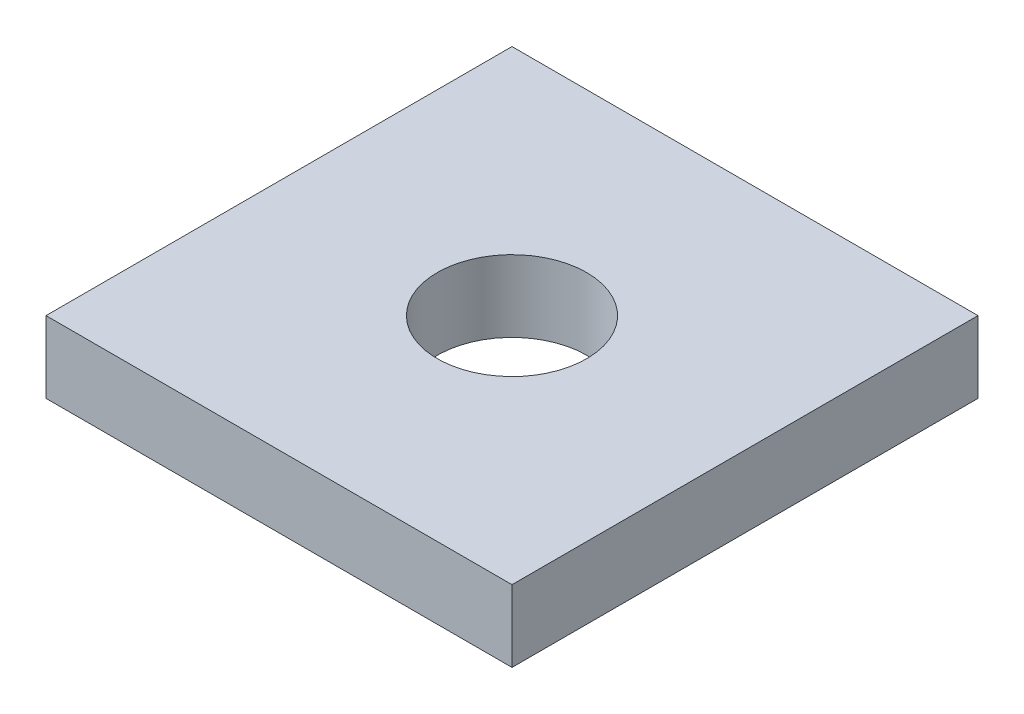
ISO-10303-21;
HEADER;
FILE_DESCRIPTION(('STEP AP214'),'2;1');
FILE_NAME('part.step','',(''),(''),'','','');
FILE_SCHEMA(('AUTOMOTIVE_DESIGN { 1 0 10303 214 1 1 1 1 }'));
ENDSEC;
DATA;
#1=APPLICATION_CONTEXT('core data for automotive mechanical design processes');
#2=APPLICATION_PROTOCOL_DEFINITION('international standard','automotive_design',2000,#1);
#3=PRODUCT_CONTEXT('',#1,'mechanical');
#4=PRODUCT('Part','Part','',(#3));
#5=PRODUCT_RELATED_PRODUCT_CATEGORY('part','',(#4));
#6=PRODUCT_DEFINITION_FORMATION('','',#4);
#7=PRODUCT_DEFINITION_CONTEXT('part definition',#1,'design');
#8=PRODUCT_DEFINITION('design','',#6,#7);
#9=PRODUCT_DEFINITION_SHAPE('','',#8);
#10=(LENGTH_UNIT() NAMED_UNIT(*) SI_UNIT(.MILLI.,.METRE.));
#11=(NAMED_UNIT(*) PLANE_ANGLE_UNIT() SI_UNIT($,.RADIAN.));
#12=(NAMED_UNIT(*) SI_UNIT($,.STERADIAN.) SOLID_ANGLE_UNIT());
#13=UNCERTAINTY_MEASURE_WITH_UNIT(LENGTH_MEASURE(1.E-05),#10,'distance_accuracy_value','');
#14=(GEOMETRIC_REPRESENTATION_CONTEXT(3) GLOBAL_UNCERTAINTY_ASSIGNED_CONTEXT((#13)) GLOBAL_UNIT_ASSIGNED_CONTEXT((#10,
#11,#12)) REPRESENTATION_CONTEXT('',''));
#15=CARTESIAN_POINT('',(0.,0.,0.));
#16=DIRECTION('',(0.,0.,1.));
#17=DIRECTION('',(1.,0.,0.));
#18=AXIS2_PLACEMENT_3D('',#15,#16,#17);
#19=CARTESIAN_POINT('',(0.,-6.,0.));
#20=DIRECTION('',(1.,0.,0.));
#21=DIRECTION('',(0.,0.,-1.));
#22=AXIS2_PLACEMENT_3D('',#19,#20,#21);
#23=PLANE('',#22);
#24=DIRECTION('',(0.,0.,-1.));
#25=VECTOR('',#24,1.);
#26=CARTESIAN_POINT('',(0.,0.,0.));
#27=LINE('',#26,#25);
#28=CARTESIAN_POINT('',(0.,0.,39.));
#29=VERTEX_POINT('',#28);
#30=CARTESIAN_POINT('',(0.,0.,0.));
#31=VERTEX_POINT('',#30);
#32=EDGE_CURVE('E116',#29,#31,#27,.T.);
#33=ORIENTED_EDGE('',*,*,#32,.F.);
#34=DIRECTION('',(0.,1.,0.));
#35=VECTOR('',#34,1.);
#36=CARTESIAN_POINT('',(0.,-6.,39.));
#37=LINE('',#36,#35);
#38=CARTESIAN_POINT('',(0.,-6.,39.));
#39=VERTEX_POINT('',#38);
#40=EDGE_CURVE('E11',#39,#29,#37,.T.);
#41=ORIENTED_EDGE('',*,*,#40,.F.);
#42=DIRECTION('',(0.,0.,-1.));
#43=VECTOR('',#42,1.);
#44=CARTESIAN_POINT('',(0.,-6.,0.));
#45=LINE('',#44,#43);
#46=CARTESIAN_POINT('',(0.,-6.,0.));
#47=VERTEX_POINT('',#46);
#48=EDGE_CURVE('E107',#39,#47,#45,.T.);
#49=ORIENTED_EDGE('',*,*,#48,.T.);
#50=DIRECTION('',(0.,1.,0.));
#51=VECTOR('',#50,1.);
#52=CARTESIAN_POINT('',(0.,-6.,0.));
#53=LINE('',#52,#51);
#54=EDGE_CURVE('E48',#47,#31,#53,.T.);
#55=ORIENTED_EDGE('',*,*,#54,.T.);
#56=EDGE_LOOP('',(#33,#41,#49,#55));
#57=FACE_BOUND('',#56,.T.);
#58=ADVANCED_FACE('F45',(#57),#23,.T.);
#59=CARTESIAN_POINT('',(0.,-6.,39.));
#60=DIRECTION('',(0.,0.,1.));
#61=DIRECTION('',(1.,0.,0.));
#62=AXIS2_PLACEMENT_3D('',#59,#60,#61);
#63=PLANE('',#62);
#64=DIRECTION('',(1.,0.,0.));
#65=VECTOR('',#64,1.);
#66=CARTESIAN_POINT('',(0.,0.,39.));
#67=LINE('',#66,#65);
#68=CARTESIAN_POINT('',(-39.,0.,39.));
#69=VERTEX_POINT('',#68);
#70=EDGE_CURVE('E110',#69,#29,#67,.T.);
#71=ORIENTED_EDGE('',*,*,#70,.F.);
#72=DIRECTION('',(0.,1.,0.));
#73=VECTOR('',#72,1.);
#74=CARTESIAN_POINT('',(-39.,-6.,39.));
#75=LINE('',#74,#73);
#76=CARTESIAN_POINT('',(-39.,-6.,39.));
#77=VERTEX_POINT('',#76);
#78=EDGE_CURVE('E55',#77,#69,#75,.T.);
#79=ORIENTED_EDGE('',*,*,#78,.F.);
#80=DIRECTION('',(1.,0.,0.));
#81=VECTOR('',#80,1.);
#82=CARTESIAN_POINT('',(0.,-6.,39.));
#83=LINE('',#82,#81);
#84=EDGE_CURVE('E102',#77,#39,#83,.T.);
#85=ORIENTED_EDGE('',*,*,#84,.T.);
#86=ORIENTED_EDGE('',*,*,#40,.T.);
#87=EDGE_LOOP('',(#71,#79,#85,#86));
#88=FACE_BOUND('',#87,.T.);
#89=ADVANCED_FACE('F133',(#88),#63,.T.);
#90=CARTESIAN_POINT('',(-39.,-6.,0.));
#91=DIRECTION('',(-1.,0.,0.));
#92=DIRECTION('',(0.,0.,1.));
#93=AXIS2_PLACEMENT_3D('',#90,#91,#92);
#94=PLANE('',#93);
#95=DIRECTION('',(0.,0.,1.));
#96=VECTOR('',#95,1.);
#97=CARTESIAN_POINT('',(-39.,0.,0.));
#98=LINE('',#97,#96);
#99=CARTESIAN_POINT('',(-39.,0.,0.));
#100=VERTEX_POINT('',#99);
#101=EDGE_CURVE('E96',#100,#69,#98,.T.);
#102=ORIENTED_EDGE('',*,*,#101,.F.);
#103=DIRECTION('',(0.,1.,0.));
#104=VECTOR('',#103,1.);
#105=CARTESIAN_POINT('',(-39.,-6.,0.));
#106=LINE('',#105,#104);
#107=CARTESIAN_POINT('',(-39.,-6.,0.));
#108=VERTEX_POINT('',#107);
#109=EDGE_CURVE('E91',#108,#100,#106,.T.);
#110=ORIENTED_EDGE('',*,*,#109,.F.);
#111=DIRECTION('',(0.,0.,1.));
#112=VECTOR('',#111,1.);
#113=CARTESIAN_POINT('',(-39.,-6.,0.));
#114=LINE('',#113,#112);
#115=EDGE_CURVE('E94',#108,#77,#114,.T.);
#116=ORIENTED_EDGE('',*,*,#115,.T.);
#117=ORIENTED_EDGE('',*,*,#78,.T.);
#118=EDGE_LOOP('',(#102,#110,#116,#117));
#119=FACE_BOUND('',#118,.T.);
#120=ADVANCED_FACE('F93',(#119),#94,.T.);
#121=CARTESIAN_POINT('',(0.,-6.,0.));
#122=DIRECTION('',(0.,0.,-1.));
#123=DIRECTION('',(-1.,0.,0.));
#124=AXIS2_PLACEMENT_3D('',#121,#122,#123);
#125=PLANE('',#124);
#126=DIRECTION('',(-1.,0.,0.));
#127=VECTOR('',#126,1.);
#128=CARTESIAN_POINT('',(0.,0.,0.));
#129=LINE('',#128,#127);
#130=EDGE_CURVE('E120',#31,#100,#129,.T.);
#131=ORIENTED_EDGE('',*,*,#130,.F.);
#132=ORIENTED_EDGE('',*,*,#54,.F.);
#133=DIRECTION('',(-1.,0.,0.));
#134=VECTOR('',#133,1.);
#135=CARTESIAN_POINT('',(0.,-6.,0.));
#136=LINE('',#135,#134);
#137=EDGE_CURVE('E101',#47,#108,#136,.T.);
#138=ORIENTED_EDGE('',*,*,#137,.T.);
#139=ORIENTED_EDGE('',*,*,#109,.T.);
#140=EDGE_LOOP('',(#131,#132,#138,#139));
#141=FACE_BOUND('',#140,.T.);
#142=ADVANCED_FACE('F105',(#141),#125,.T.);
#143=CARTESIAN_POINT('',(0.,-6.,0.));
#144=DIRECTION('',(0.,-1.,0.));
#145=DIRECTION('',(0.,0.,-1.));
#146=AXIS2_PLACEMENT_3D('',#143,#144,#145);
#147=PLANE('',#146);
#148=CARTESIAN_POINT('',(-19.5,-6.,19.5));
#149=DIRECTION('',(0.,-1.,0.));
#150=DIRECTION('',(0.,0.,-1.));
#151=AXIS2_PLACEMENT_3D('',#148,#149,#150);
#152=CIRCLE('',#151,6.25);
#153=CARTESIAN_POINT('',(-19.5,-6.,13.25));
#154=VERTEX_POINT('',#153);
#155=EDGE_CURVE('E163',#154,#154,#152,.T.);
#156=ORIENTED_EDGE('',*,*,#155,.F.);
#157=EDGE_LOOP('',(#156));
#158=FACE_BOUND('',#157,.T.);
#159=ORIENTED_EDGE('',*,*,#48,.F.);
#160=ORIENTED_EDGE('',*,*,#84,.F.);
#161=ORIENTED_EDGE('',*,*,#115,.F.);
#162=ORIENTED_EDGE('',*,*,#137,.F.);
#163=EDGE_LOOP('',(#159,#160,#161,#162));
#164=FACE_BOUND('',#163,.T.);
#165=ADVANCED_FACE('F100',(#158,#164),#147,.T.);
#166=CARTESIAN_POINT('',(0.,0.,0.));
#167=DIRECTION('',(0.,-1.,0.));
#168=DIRECTION('',(0.,0.,-1.));
#169=AXIS2_PLACEMENT_3D('',#166,#167,#168);
#170=PLANE('',#169);
#171=CARTESIAN_POINT('',(-19.5,0.,19.5));
#172=DIRECTION('',(0.,-1.,0.));
#173=DIRECTION('',(0.,0.,-1.));
#174=AXIS2_PLACEMENT_3D('',#171,#172,#173);
#175=CIRCLE('',#174,6.25);
#176=CARTESIAN_POINT('',(-19.5,0.,13.25));
#177=VERTEX_POINT('',#176);
#178=EDGE_CURVE('E121',#177,#177,#175,.T.);
#179=ORIENTED_EDGE('',*,*,#178,.T.);
#180=EDGE_LOOP('',(#179));
#181=FACE_BOUND('',#180,.T.);
#182=ORIENTED_EDGE('',*,*,#32,.T.);
#183=ORIENTED_EDGE('',*,*,#130,.T.);
#184=ORIENTED_EDGE('',*,*,#101,.T.);
#185=ORIENTED_EDGE('',*,*,#70,.T.);
#186=EDGE_LOOP('',(#182,#183,#184,#185));
#187=FACE_BOUND('',#186,.T.);
#188=ADVANCED_FACE('F132',(#181,#187),#170,.F.);
#189=CARTESIAN_POINT('',(-19.5,0.,19.5));
#190=DIRECTION('',(0.,-1.,0.));
#191=DIRECTION('',(0.,0.,-1.));
#192=AXIS2_PLACEMENT_3D('',#189,#190,#191);
#193=CYLINDRICAL_SURFACE('',#192,6.25);
#194=ORIENTED_EDGE('',*,*,#178,.F.);
#195=EDGE_LOOP('',(#194));
#196=FACE_BOUND('',#195,.T.);
#197=ORIENTED_EDGE('',*,*,#155,.T.);
#198=EDGE_LOOP('',(#197));
#199=FACE_BOUND('',#198,.T.);
#200=ADVANCED_FACE('F151',(#196,#199),#193,.F.);
#201=CLOSED_SHELL('',(#58,#89,#120,#142,#165,#188,#200));
#202=MANIFOLD_SOLID_BREP('B2',#201);
#203=ADVANCED_BREP_SHAPE_REPRESENTATION('',(#18,#202),#14);
#204=SHAPE_DEFINITION_REPRESENTATION(#9,#203);
ENDSEC;
END-ISO-10303-21;
